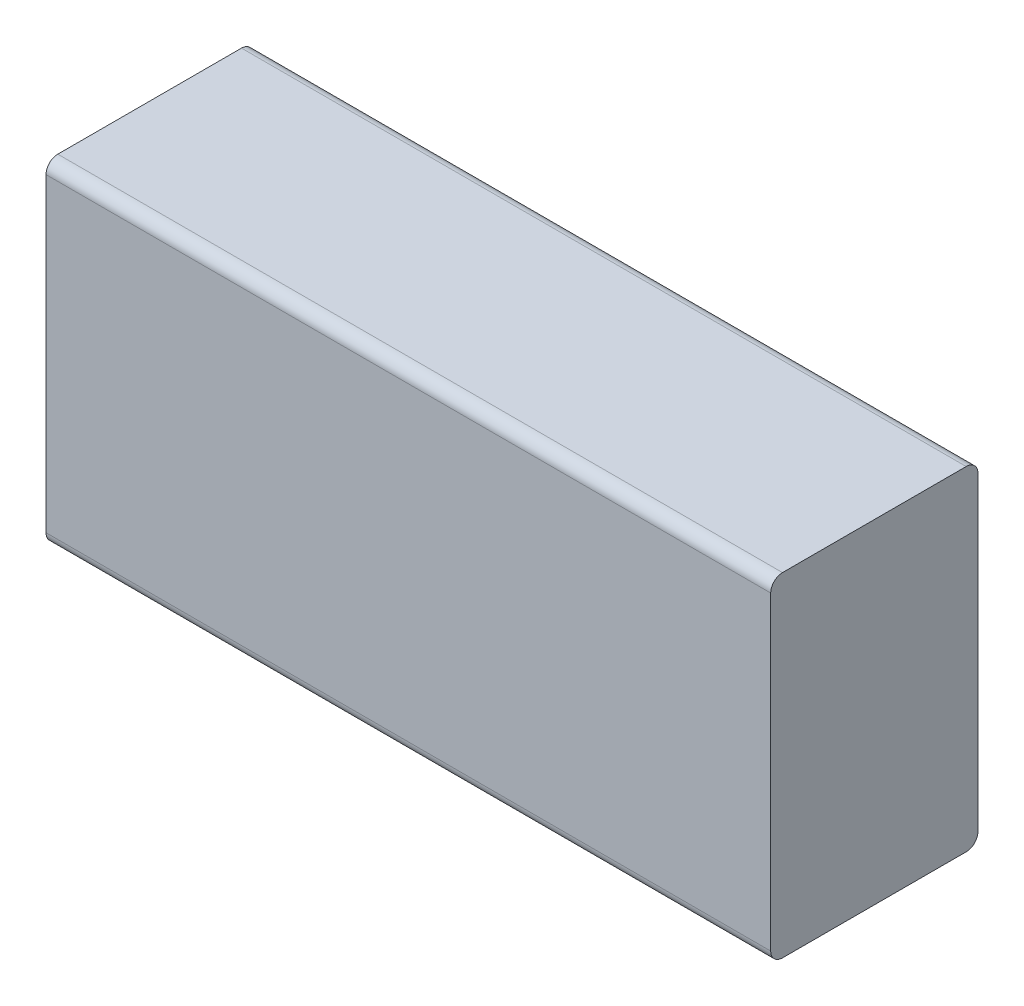
ISO-10303-21;
HEADER;
FILE_DESCRIPTION(('STEP AP214'),'2;1');
FILE_NAME('part.step','',(''),(''),'','','');
FILE_SCHEMA(('AUTOMOTIVE_DESIGN { 1 0 10303 214 1 1 1 1 }'));
ENDSEC;
DATA;
#1=APPLICATION_CONTEXT('core data for automotive mechanical design processes');
#2=APPLICATION_PROTOCOL_DEFINITION('international standard','automotive_design',2000,#1);
#3=PRODUCT_CONTEXT('',#1,'mechanical');
#4=PRODUCT('Part','Part','',(#3));
#5=PRODUCT_RELATED_PRODUCT_CATEGORY('part','',(#4));
#6=PRODUCT_DEFINITION_FORMATION('','',#4);
#7=PRODUCT_DEFINITION_CONTEXT('part definition',#1,'design');
#8=PRODUCT_DEFINITION('design','',#6,#7);
#9=PRODUCT_DEFINITION_SHAPE('','',#8);
#10=(LENGTH_UNIT() NAMED_UNIT(*) SI_UNIT(.MILLI.,.METRE.));
#11=(NAMED_UNIT(*) PLANE_ANGLE_UNIT() SI_UNIT($,.RADIAN.));
#12=(NAMED_UNIT(*) SI_UNIT($,.STERADIAN.) SOLID_ANGLE_UNIT());
#13=UNCERTAINTY_MEASURE_WITH_UNIT(LENGTH_MEASURE(1.E-05),#10,'distance_accuracy_value','');
#14=(GEOMETRIC_REPRESENTATION_CONTEXT(3) GLOBAL_UNCERTAINTY_ASSIGNED_CONTEXT((#13)) GLOBAL_UNIT_ASSIGNED_CONTEXT((#10,
#11,#12)) REPRESENTATION_CONTEXT('',''));
#15=CARTESIAN_POINT('',(0.,0.,0.));
#16=DIRECTION('',(0.,0.,1.));
#17=DIRECTION('',(1.,0.,0.));
#18=AXIS2_PLACEMENT_3D('',#15,#16,#17);
#19=CARTESIAN_POINT('',(-2.15,0.919999421393,0.02));
#20=DIRECTION('',(0.,-1.36922263702E-12,-1.));
#21=DIRECTION('',(0.,1.,-1.36922263702E-12));
#22=AXIS2_PLACEMENT_3D('',#19,#20,#21);
#23=PLANE('',#22);
#24=DIRECTION('',(-1.,0.,0.));
#25=VECTOR('',#24,1.);
#26=CARTESIAN_POINT('',(-2.15,-0.919999406224,0.0200000000025194));
#27=LINE('',#26,#25);
#28=CARTESIAN_POINT('',(2.15,-0.919999703112048,0.020000000002521));
#29=VERTEX_POINT('',#28);
#30=CARTESIAN_POINT('',(-2.15,-0.919999703112048,0.0200000000025194));
#31=VERTEX_POINT('',#30);
#32=EDGE_CURVE('E11',#29,#31,#27,.T.);
#33=ORIENTED_EDGE('',*,*,#32,.T.);
#34=DIRECTION('',(0.,1.,-1.36922263702E-12));
#35=VECTOR('',#34,1.);
#36=CARTESIAN_POINT('',(-2.15,0.919999421393,0.02));
#37=LINE('',#36,#35);
#38=CARTESIAN_POINT('',(-2.15,0.919999421392952,0.02));
#39=VERTEX_POINT('',#38);
#40=EDGE_CURVE('E24',#31,#39,#37,.T.);
#41=ORIENTED_EDGE('',*,*,#40,.T.);
#42=DIRECTION('',(1.,0.,0.));
#43=VECTOR('',#42,1.);
#44=CARTESIAN_POINT('',(-2.15,0.919999421393,0.02));
#45=LINE('',#44,#43);
#46=CARTESIAN_POINT('',(2.15,0.919999421392951,0.0200000000000017));
#47=VERTEX_POINT('',#46);
#48=EDGE_CURVE('E139',#39,#47,#45,.T.);
#49=ORIENTED_EDGE('',*,*,#48,.T.);
#50=DIRECTION('',(0.,-1.,1.36922263702E-12));
#51=VECTOR('',#50,1.);
#52=CARTESIAN_POINT('',(2.15,0.919999421393,0.0200000000000017));
#53=LINE('',#52,#51);
#54=EDGE_CURVE('E84',#47,#29,#53,.T.);
#55=ORIENTED_EDGE('',*,*,#54,.T.);
#56=EDGE_LOOP('',(#33,#41,#49,#55));
#57=FACE_BOUND('',#56,.T.);
#58=ADVANCED_FACE('F17',(#57),#23,.T.);
#59=CARTESIAN_POINT('',(-2.15,-1.413269357338E-07,0.635000054325));
#60=DIRECTION('',(1.,0.,0.));
#61=DIRECTION('',(0.,1.,0.));
#62=AXIS2_PLACEMENT_3D('',#59,#60,#61);
#63=PLANE('',#62);
#64=CARTESIAN_POINT('',(-2.15,0.92,1.18));
#65=DIRECTION('',(1.,0.,0.));
#66=DIRECTION('',(0.,0.,1.));
#67=AXIS2_PLACEMENT_3D('',#64,#65,#66);
#68=CIRCLE('',#67,0.07);
#69=CARTESIAN_POINT('',(-2.15,0.98999999999999,1.17999998142089));
#70=VERTEX_POINT('',#69);
#71=CARTESIAN_POINT('',(-2.15,0.9199997106965,1.24999999999756));
#72=VERTEX_POINT('',#71);
#73=EDGE_CURVE('E136',#70,#72,#68,.T.);
#74=ORIENTED_EDGE('',*,*,#73,.F.);
#75=DIRECTION('',(0.,5.30831730383325E-07,0.999999999999859));
#76=VECTOR('',#75,1.);
#77=CARTESIAN_POINT('',(-2.15,0.99,1.18));
#78=LINE('',#77,#76);
#79=CARTESIAN_POINT('',(-2.15,0.9899994213933,0.0899999814208894));
#80=VERTEX_POINT('',#79);
#81=EDGE_CURVE('E134',#80,#70,#78,.T.);
#82=ORIENTED_EDGE('',*,*,#81,.F.);
#83=CARTESIAN_POINT('',(-2.15,0.919999421393,0.09));
#84=DIRECTION('',(1.,0.,0.));
#85=DIRECTION('',(0.,0.,1.));
#86=AXIS2_PLACEMENT_3D('',#83,#84,#85);
#87=CIRCLE('',#86,0.07);
#88=EDGE_CURVE('E101',#39,#80,#87,.T.);
#89=ORIENTED_EDGE('',*,*,#88,.F.);
#90=ORIENTED_EDGE('',*,*,#40,.F.);
#91=CARTESIAN_POINT('',(-2.15,-0.92,0.09));
#92=DIRECTION('',(1.,0.,0.));
#93=DIRECTION('',(0.,0.,1.));
#94=AXIS2_PLACEMENT_3D('',#91,#92,#93);
#95=CIRCLE('',#94,0.07);
#96=CARTESIAN_POINT('',(-2.15,-0.99,0.0899999999999988));
#97=VERTEX_POINT('',#96);
#98=EDGE_CURVE('E131',#97,#31,#95,.T.);
#99=ORIENTED_EDGE('',*,*,#98,.F.);
#100=DIRECTION('',(0.,0.,1.));
#101=VECTOR('',#100,1.);
#102=CARTESIAN_POINT('',(-2.15,-0.99,1.18));
#103=LINE('',#102,#101);
#104=CARTESIAN_POINT('',(-2.15,-0.99,1.18));
#105=VERTEX_POINT('',#104);
#106=EDGE_CURVE('E129',#97,#105,#103,.T.);
#107=ORIENTED_EDGE('',*,*,#106,.T.);
#108=CARTESIAN_POINT('',(-2.15,-0.92,1.18));
#109=DIRECTION('',(1.,0.,0.));
#110=DIRECTION('',(0.,0.,1.));
#111=AXIS2_PLACEMENT_3D('',#108,#109,#110);
#112=CIRCLE('',#111,0.07);
#113=CARTESIAN_POINT('',(-2.15,-0.919999703112,1.2499999999975));
#114=VERTEX_POINT('',#113);
#115=EDGE_CURVE('E126',#114,#105,#112,.T.);
#116=ORIENTED_EDGE('',*,*,#115,.F.);
#117=DIRECTION('',(0.,-1.,0.));
#118=VECTOR('',#117,1.);
#119=CARTESIAN_POINT('',(-2.15,-1.413269357338E-07,1.249999999998));
#120=LINE('',#119,#118);
#121=EDGE_CURVE('E123',#72,#114,#120,.T.);
#122=ORIENTED_EDGE('',*,*,#121,.F.);
#123=EDGE_LOOP('',(#74,#82,#89,#90,#99,#107,#116,#122));
#124=FACE_BOUND('',#123,.T.);
#125=ADVANCED_FACE('F141',(#124),#63,.F.);
#126=CARTESIAN_POINT('',(-2.15,-0.92,0.09));
#127=DIRECTION('',(-1.,0.,0.));
#128=DIRECTION('',(0.,0.,1.));
#129=AXIS2_PLACEMENT_3D('',#126,#127,#128);
#130=CYLINDRICAL_SURFACE('',#129,0.07);
#131=CARTESIAN_POINT('',(2.15,-0.920000000000001,0.0900000000000024));
#132=DIRECTION('',(-1.,0.,0.));
#133=DIRECTION('',(0.,0.,1.));
#134=AXIS2_PLACEMENT_3D('',#131,#132,#133);
#135=CIRCLE('',#134,0.07);
#136=CARTESIAN_POINT('',(2.15,-0.99,0.0900000000000012));
#137=VERTEX_POINT('',#136);
#138=EDGE_CURVE('E121',#29,#137,#135,.T.);
#139=ORIENTED_EDGE('',*,*,#138,.T.);
#140=DIRECTION('',(-1.,0.,0.));
#141=VECTOR('',#140,1.);
#142=CARTESIAN_POINT('',(-2.15,-0.99,0.0899999999999976));
#143=LINE('',#142,#141);
#144=EDGE_CURVE('E118',#137,#97,#143,.T.);
#145=ORIENTED_EDGE('',*,*,#144,.T.);
#146=ORIENTED_EDGE('',*,*,#98,.T.);
#147=ORIENTED_EDGE('',*,*,#32,.F.);
#148=EDGE_LOOP('',(#139,#145,#146,#147));
#149=FACE_BOUND('',#148,.T.);
#150=ADVANCED_FACE('F163',(#149),#130,.T.);
#151=CARTESIAN_POINT('',(2.15,-1.413269376434E-07,0.635000054325));
#152=DIRECTION('',(1.,0.,0.));
#153=DIRECTION('',(0.,1.,0.));
#154=AXIS2_PLACEMENT_3D('',#151,#152,#153);
#155=PLANE('',#154);
#156=CARTESIAN_POINT('',(2.15,0.919999999999999,1.18));
#157=DIRECTION('',(-1.,0.,0.));
#158=DIRECTION('',(0.,0.,1.));
#159=AXIS2_PLACEMENT_3D('',#156,#157,#158);
#160=CIRCLE('',#159,0.07);
#161=CARTESIAN_POINT('',(2.15,0.919999710696499,1.24999999999756));
#162=VERTEX_POINT('',#161);
#163=CARTESIAN_POINT('',(2.15,0.989999999999988,1.17999998142089));
#164=VERTEX_POINT('',#163);
#165=EDGE_CURVE('E116',#162,#164,#160,.T.);
#166=ORIENTED_EDGE('',*,*,#165,.F.);
#167=DIRECTION('',(0.,-1.,0.));
#168=VECTOR('',#167,1.);
#169=CARTESIAN_POINT('',(2.15,-1.413269376434E-07,1.249999999998));
#170=LINE('',#169,#168);
#171=CARTESIAN_POINT('',(2.15,-0.919999703112001,1.2499999999975));
#172=VERTEX_POINT('',#171);
#173=EDGE_CURVE('E114',#162,#172,#170,.T.);
#174=ORIENTED_EDGE('',*,*,#173,.T.);
#175=CARTESIAN_POINT('',(2.15,-0.920000000000001,1.18));
#176=DIRECTION('',(-1.,0.,0.));
#177=DIRECTION('',(0.,0.,1.));
#178=AXIS2_PLACEMENT_3D('',#175,#176,#177);
#179=CIRCLE('',#178,0.07);
#180=CARTESIAN_POINT('',(2.15,-0.990000000000001,1.18));
#181=VERTEX_POINT('',#180);
#182=EDGE_CURVE('E111',#181,#172,#179,.T.);
#183=ORIENTED_EDGE('',*,*,#182,.F.);
#184=DIRECTION('',(0.,0.,-1.));
#185=VECTOR('',#184,1.);
#186=CARTESIAN_POINT('',(2.15,-0.99,0.635000054325));
#187=LINE('',#186,#185);
#188=EDGE_CURVE('E88',#181,#137,#187,.T.);
#189=ORIENTED_EDGE('',*,*,#188,.T.);
#190=ORIENTED_EDGE('',*,*,#138,.F.);
#191=ORIENTED_EDGE('',*,*,#54,.F.);
#192=CARTESIAN_POINT('',(2.15,0.919999421392999,0.0900000000000024));
#193=DIRECTION('',(1.,0.,0.));
#194=DIRECTION('',(0.,0.,1.));
#195=AXIS2_PLACEMENT_3D('',#192,#193,#194);
#196=CIRCLE('',#195,0.07);
#197=CARTESIAN_POINT('',(2.15,0.989999421393299,0.0899999814208918));
#198=VERTEX_POINT('',#197);
#199=EDGE_CURVE('E78',#47,#198,#196,.T.);
#200=ORIENTED_EDGE('',*,*,#199,.T.);
#201=DIRECTION('',(0.,-5.30831730383325E-07,-0.999999999999859));
#202=VECTOR('',#201,1.);
#203=CARTESIAN_POINT('',(2.15,0.989999999999998,1.18));
#204=LINE('',#203,#202);
#205=EDGE_CURVE('E81',#164,#198,#204,.T.);
#206=ORIENTED_EDGE('',*,*,#205,.F.);
#207=EDGE_LOOP('',(#166,#174,#183,#189,#190,#191,#200,#206));
#208=FACE_BOUND('',#207,.T.);
#209=ADVANCED_FACE('F80',(#208),#155,.T.);
#210=CARTESIAN_POINT('',(-2.15,0.919999421393,0.09));
#211=DIRECTION('',(-1.,0.,0.));
#212=DIRECTION('',(0.,0.,1.));
#213=AXIS2_PLACEMENT_3D('',#210,#211,#212);
#214=CYLINDRICAL_SURFACE('',#213,0.07);
#215=ORIENTED_EDGE('',*,*,#199,.F.);
#216=ORIENTED_EDGE('',*,*,#48,.F.);
#217=ORIENTED_EDGE('',*,*,#88,.T.);
#218=DIRECTION('',(1.,0.,0.));
#219=VECTOR('',#218,1.);
#220=CARTESIAN_POINT('',(-2.15,0.989999421393,0.09));
#221=LINE('',#220,#219);
#222=EDGE_CURVE('E94',#80,#198,#221,.T.);
#223=ORIENTED_EDGE('',*,*,#222,.T.);
#224=EDGE_LOOP('',(#215,#216,#217,#223));
#225=FACE_BOUND('',#224,.T.);
#226=ADVANCED_FACE('F99',(#225),#214,.T.);
#227=CARTESIAN_POINT('',(-2.15,-0.919999406224,1.249999999997));
#228=DIRECTION('',(0.,0.,1.));
#229=DIRECTION('',(0.,-1.,0.));
#230=AXIS2_PLACEMENT_3D('',#227,#228,#229);
#231=PLANE('',#230);
#232=DIRECTION('',(-1.,0.,0.));
#233=VECTOR('',#232,1.);
#234=CARTESIAN_POINT('',(-2.15,0.919999421393,1.24999999999713));
#235=LINE('',#234,#233);
#236=EDGE_CURVE('E102',#162,#72,#235,.T.);
#237=ORIENTED_EDGE('',*,*,#236,.T.);
#238=ORIENTED_EDGE('',*,*,#121,.T.);
#239=DIRECTION('',(1.,0.,0.));
#240=VECTOR('',#239,1.);
#241=CARTESIAN_POINT('',(-2.15,-0.919999406224,1.249999999997));
#242=LINE('',#241,#240);
#243=EDGE_CURVE('E105',#114,#172,#242,.T.);
#244=ORIENTED_EDGE('',*,*,#243,.T.);
#245=ORIENTED_EDGE('',*,*,#173,.F.);
#246=EDGE_LOOP('',(#237,#238,#244,#245));
#247=FACE_BOUND('',#246,.T.);
#248=ADVANCED_FACE('F154',(#247),#231,.T.);
#249=CARTESIAN_POINT('',(-2.15,-0.99,1.18));
#250=DIRECTION('',(0.,1.,0.));
#251=DIRECTION('',(-1.,0.,0.));
#252=AXIS2_PLACEMENT_3D('',#249,#250,#251);
#253=PLANE('',#252);
#254=ORIENTED_EDGE('',*,*,#144,.F.);
#255=ORIENTED_EDGE('',*,*,#188,.F.);
#256=DIRECTION('',(1.,0.,0.));
#257=VECTOR('',#256,1.);
#258=CARTESIAN_POINT('',(-2.15,-0.99,1.18));
#259=LINE('',#258,#257);
#260=EDGE_CURVE('E146',#105,#181,#259,.T.);
#261=ORIENTED_EDGE('',*,*,#260,.F.);
#262=ORIENTED_EDGE('',*,*,#106,.F.);
#263=EDGE_LOOP('',(#254,#255,#261,#262));
#264=FACE_BOUND('',#263,.T.);
#265=ADVANCED_FACE('F161',(#264),#253,.F.);
#266=CARTESIAN_POINT('',(-2.15,0.99,1.18));
#267=DIRECTION('',(0.,0.999999999999859,-5.30831730383325E-07));
#268=DIRECTION('',(0.,5.30831730383325E-07,0.999999999999859));
#269=AXIS2_PLACEMENT_3D('',#266,#267,#268);
#270=PLANE('',#269);
#271=ORIENTED_EDGE('',*,*,#222,.F.);
#272=ORIENTED_EDGE('',*,*,#81,.T.);
#273=DIRECTION('',(1.,0.,0.));
#274=VECTOR('',#273,1.);
#275=CARTESIAN_POINT('',(-2.15,0.99,1.18));
#276=LINE('',#275,#274);
#277=EDGE_CURVE('E96',#70,#164,#276,.T.);
#278=ORIENTED_EDGE('',*,*,#277,.T.);
#279=ORIENTED_EDGE('',*,*,#205,.T.);
#280=EDGE_LOOP('',(#271,#272,#278,#279));
#281=FACE_BOUND('',#280,.T.);
#282=ADVANCED_FACE('F92',(#281),#270,.T.);
#283=CARTESIAN_POINT('',(-2.15,0.92,1.18));
#284=DIRECTION('',(-1.,0.,0.));
#285=DIRECTION('',(0.,0.,1.));
#286=AXIS2_PLACEMENT_3D('',#283,#284,#285);
#287=CYLINDRICAL_SURFACE('',#286,0.07);
#288=ORIENTED_EDGE('',*,*,#165,.T.);
#289=ORIENTED_EDGE('',*,*,#277,.F.);
#290=ORIENTED_EDGE('',*,*,#73,.T.);
#291=ORIENTED_EDGE('',*,*,#236,.F.);
#292=EDGE_LOOP('',(#288,#289,#290,#291));
#293=FACE_BOUND('',#292,.T.);
#294=ADVANCED_FACE('F144',(#293),#287,.T.);
#295=CARTESIAN_POINT('',(-2.15,-0.92,1.18));
#296=DIRECTION('',(-1.,0.,0.));
#297=DIRECTION('',(0.,0.,1.));
#298=AXIS2_PLACEMENT_3D('',#295,#296,#297);
#299=CYLINDRICAL_SURFACE('',#298,0.07);
#300=ORIENTED_EDGE('',*,*,#182,.T.);
#301=ORIENTED_EDGE('',*,*,#243,.F.);
#302=ORIENTED_EDGE('',*,*,#115,.T.);
#303=ORIENTED_EDGE('',*,*,#260,.T.);
#304=EDGE_LOOP('',(#300,#301,#302,#303));
#305=FACE_BOUND('',#304,.T.);
#306=ADVANCED_FACE('F156',(#305),#299,.T.);
#307=CLOSED_SHELL('',(#58,#125,#150,#209,#226,#248,#265,#282,#294,#306));
#308=MANIFOLD_SOLID_BREP('B1',#307);
#309=ADVANCED_BREP_SHAPE_REPRESENTATION('',(#18,#308),#14);
#310=SHAPE_DEFINITION_REPRESENTATION(#9,#309);
ENDSEC;
END-ISO-10303-21;
